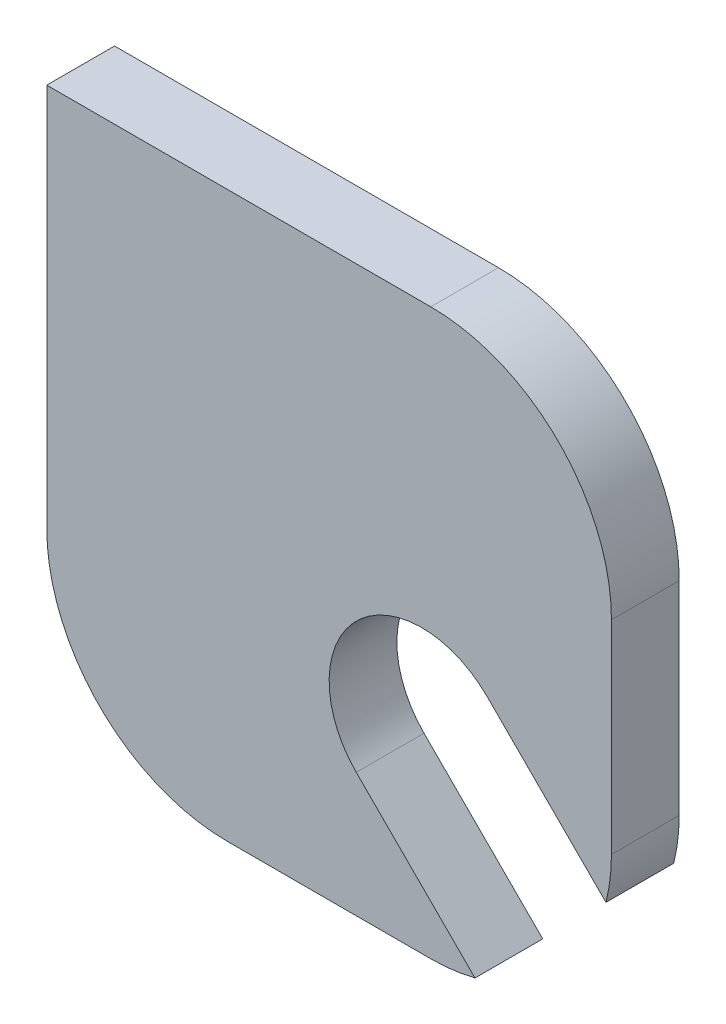
ISO-10303-21;
HEADER;
FILE_DESCRIPTION(('STEP AP214'),'2;1');
FILE_NAME('part.step','',(''),(''),'','','');
FILE_SCHEMA(('AUTOMOTIVE_DESIGN { 1 0 10303 214 1 1 1 1 }'));
ENDSEC;
DATA;
#1=APPLICATION_CONTEXT('core data for automotive mechanical design processes');
#2=APPLICATION_PROTOCOL_DEFINITION('international standard','automotive_design',2000,#1);
#3=PRODUCT_CONTEXT('',#1,'mechanical');
#4=PRODUCT('Part','Part','',(#3));
#5=PRODUCT_RELATED_PRODUCT_CATEGORY('part','',(#4));
#6=PRODUCT_DEFINITION_FORMATION('','',#4);
#7=PRODUCT_DEFINITION_CONTEXT('part definition',#1,'design');
#8=PRODUCT_DEFINITION('design','',#6,#7);
#9=PRODUCT_DEFINITION_SHAPE('','',#8);
#10=(LENGTH_UNIT() NAMED_UNIT(*) SI_UNIT(.MILLI.,.METRE.));
#11=(NAMED_UNIT(*) PLANE_ANGLE_UNIT() SI_UNIT($,.RADIAN.));
#12=(NAMED_UNIT(*) SI_UNIT($,.STERADIAN.) SOLID_ANGLE_UNIT());
#13=UNCERTAINTY_MEASURE_WITH_UNIT(LENGTH_MEASURE(1.E-05),#10,'distance_accuracy_value','');
#14=(GEOMETRIC_REPRESENTATION_CONTEXT(3) GLOBAL_UNCERTAINTY_ASSIGNED_CONTEXT((#13)) GLOBAL_UNIT_ASSIGNED_CONTEXT((#10,
#11,#12)) REPRESENTATION_CONTEXT('',''));
#15=CARTESIAN_POINT('',(0.,0.,0.));
#16=DIRECTION('',(0.,0.,1.));
#17=DIRECTION('',(1.,0.,0.));
#18=AXIS2_PLACEMENT_3D('',#15,#16,#17);
#19=CARTESIAN_POINT('',(4.5,-4.5,3.));
#20=DIRECTION('',(0.,0.,1.));
#21=DIRECTION('',(1.,0.,0.));
#22=AXIS2_PLACEMENT_3D('',#19,#20,#21);
#23=CYLINDRICAL_SURFACE('',#22,8.);
#24=DIRECTION('',(0.,0.,1.));
#25=VECTOR('',#24,1.);
#26=CARTESIAN_POINT('',(6.45833067361547,-12.2566062793452,0.));
#27=LINE('',#26,#25);
#28=CARTESIAN_POINT('',(6.45833067361547,-12.2566062793452,0.));
#29=VERTEX_POINT('',#28);
#30=CARTESIAN_POINT('',(6.45833067361547,-12.2566062793452,3.));
#31=VERTEX_POINT('',#30);
#32=EDGE_CURVE('E212',#29,#31,#27,.T.);
#33=ORIENTED_EDGE('',*,*,#32,.T.);
#34=CARTESIAN_POINT('',(4.5,-4.5,3.));
#35=DIRECTION('',(0.,0.,1.));
#36=DIRECTION('',(1.,0.,0.));
#37=AXIS2_PLACEMENT_3D('',#34,#35,#36);
#38=CIRCLE('',#37,8.);
#39=CARTESIAN_POINT('',(4.5,-12.5,3.));
#40=VERTEX_POINT('',#39);
#41=EDGE_CURVE('E140',#40,#31,#38,.T.);
#42=ORIENTED_EDGE('',*,*,#41,.F.);
#43=DIRECTION('',(0.,0.,1.));
#44=VECTOR('',#43,1.);
#45=CARTESIAN_POINT('',(4.5,-12.5,3.));
#46=LINE('',#45,#44);
#47=CARTESIAN_POINT('',(4.5,-12.5,0.));
#48=VERTEX_POINT('',#47);
#49=EDGE_CURVE('E190',#48,#40,#46,.T.);
#50=ORIENTED_EDGE('',*,*,#49,.F.);
#51=CARTESIAN_POINT('',(4.5,-4.5,0.));
#52=DIRECTION('',(0.,0.,1.));
#53=DIRECTION('',(1.,0.,0.));
#54=AXIS2_PLACEMENT_3D('',#51,#52,#53);
#55=CIRCLE('',#54,8.);
#56=EDGE_CURVE('E138',#29,#48,#55,.F.);
#57=ORIENTED_EDGE('',*,*,#56,.F.);
#58=EDGE_LOOP('',(#33,#42,#50,#57));
#59=FACE_BOUND('',#58,.T.);
#60=ADVANCED_FACE('F35',(#59),#23,.T.);
#61=CARTESIAN_POINT('',(4.5,4.5,3.));
#62=DIRECTION('',(0.,0.,1.));
#63=DIRECTION('',(1.,0.,0.));
#64=AXIS2_PLACEMENT_3D('',#61,#62,#63);
#65=CYLINDRICAL_SURFACE('',#64,8.);
#66=DIRECTION('',(0.,0.,1.));
#67=VECTOR('',#66,1.);
#68=CARTESIAN_POINT('',(12.5,4.5,3.));
#69=LINE('',#68,#67);
#70=CARTESIAN_POINT('',(12.5,4.5,0.));
#71=VERTEX_POINT('',#70);
#72=CARTESIAN_POINT('',(12.5,4.5,3.));
#73=VERTEX_POINT('',#72);
#74=EDGE_CURVE('E147',#71,#73,#69,.T.);
#75=ORIENTED_EDGE('',*,*,#74,.F.);
#76=CARTESIAN_POINT('',(4.5,4.5,0.));
#77=DIRECTION('',(0.,0.,1.));
#78=DIRECTION('',(1.,0.,0.));
#79=AXIS2_PLACEMENT_3D('',#76,#77,#78);
#80=CIRCLE('',#79,8.);
#81=CARTESIAN_POINT('',(4.5,12.5,0.));
#82=VERTEX_POINT('',#81);
#83=EDGE_CURVE('E43',#82,#71,#80,.F.);
#84=ORIENTED_EDGE('',*,*,#83,.F.);
#85=DIRECTION('',(0.,0.,1.));
#86=VECTOR('',#85,1.);
#87=CARTESIAN_POINT('',(4.5,12.5,3.));
#88=LINE('',#87,#86);
#89=CARTESIAN_POINT('',(4.5,12.5,3.));
#90=VERTEX_POINT('',#89);
#91=EDGE_CURVE('E150',#90,#82,#88,.F.);
#92=ORIENTED_EDGE('',*,*,#91,.F.);
#93=CARTESIAN_POINT('',(4.5,4.5,3.));
#94=DIRECTION('',(0.,0.,1.));
#95=DIRECTION('',(1.,0.,0.));
#96=AXIS2_PLACEMENT_3D('',#93,#94,#95);
#97=CIRCLE('',#96,8.);
#98=EDGE_CURVE('E11',#73,#90,#97,.T.);
#99=ORIENTED_EDGE('',*,*,#98,.F.);
#100=EDGE_LOOP('',(#75,#84,#92,#99));
#101=FACE_BOUND('',#100,.T.);
#102=ADVANCED_FACE('F37',(#101),#65,.T.);
#103=DIRECTION('',(0.,0.,1.));
#104=VECTOR('',#103,1.);
#105=CARTESIAN_POINT('',(12.2566062793452,-6.45833067361548,0.));
#106=LINE('',#105,#104);
#107=CARTESIAN_POINT('',(12.2566062793452,-6.45833067361548,0.));
#108=VERTEX_POINT('',#107);
#109=CARTESIAN_POINT('',(12.2566062793452,-6.45833067361548,3.));
#110=VERTEX_POINT('',#109);
#111=EDGE_CURVE('E118',#108,#110,#106,.T.);
#112=ORIENTED_EDGE('',*,*,#111,.F.);
#113=CARTESIAN_POINT('',(12.5,-4.5,0.));
#114=VERTEX_POINT('',#113);
#115=EDGE_CURVE('E130',#114,#108,#55,.F.);
#116=ORIENTED_EDGE('',*,*,#115,.F.);
#117=DIRECTION('',(0.,0.,1.));
#118=VECTOR('',#117,1.);
#119=CARTESIAN_POINT('',(12.5,-4.5,3.));
#120=LINE('',#119,#118);
#121=CARTESIAN_POINT('',(12.5,-4.5,3.));
#122=VERTEX_POINT('',#121);
#123=EDGE_CURVE('E142',#122,#114,#120,.F.);
#124=ORIENTED_EDGE('',*,*,#123,.F.);
#125=EDGE_CURVE('E132',#110,#122,#38,.T.);
#126=ORIENTED_EDGE('',*,*,#125,.F.);
#127=EDGE_LOOP('',(#112,#116,#124,#126));
#128=FACE_BOUND('',#127,.T.);
#129=ADVANCED_FACE('F128',(#128),#23,.T.);
#130=CARTESIAN_POINT('',(-4.5,-4.5,3.));
#131=DIRECTION('',(0.,0.,1.));
#132=DIRECTION('',(1.,0.,0.));
#133=AXIS2_PLACEMENT_3D('',#130,#131,#132);
#134=CYLINDRICAL_SURFACE('',#133,8.);
#135=DIRECTION('',(0.,0.,1.));
#136=VECTOR('',#135,1.);
#137=CARTESIAN_POINT('',(-12.5,-4.5,3.));
#138=LINE('',#137,#136);
#139=CARTESIAN_POINT('',(-12.5,-4.5,0.));
#140=VERTEX_POINT('',#139);
#141=CARTESIAN_POINT('',(-12.5,-4.5,3.));
#142=VERTEX_POINT('',#141);
#143=EDGE_CURVE('E181',#140,#142,#138,.T.);
#144=ORIENTED_EDGE('',*,*,#143,.F.);
#145=CARTESIAN_POINT('',(-4.5,-4.5,0.));
#146=DIRECTION('',(0.,0.,1.));
#147=DIRECTION('',(1.,0.,0.));
#148=AXIS2_PLACEMENT_3D('',#145,#146,#147);
#149=CIRCLE('',#148,8.);
#150=CARTESIAN_POINT('',(-4.5,-12.5,0.));
#151=VERTEX_POINT('',#150);
#152=EDGE_CURVE('E187',#151,#140,#149,.F.);
#153=ORIENTED_EDGE('',*,*,#152,.F.);
#154=DIRECTION('',(0.,0.,1.));
#155=VECTOR('',#154,1.);
#156=CARTESIAN_POINT('',(-4.5,-12.5,3.));
#157=LINE('',#156,#155);
#158=CARTESIAN_POINT('',(-4.5,-12.5,3.));
#159=VERTEX_POINT('',#158);
#160=EDGE_CURVE('E184',#159,#151,#157,.F.);
#161=ORIENTED_EDGE('',*,*,#160,.F.);
#162=CARTESIAN_POINT('',(-4.5,-4.5,3.));
#163=DIRECTION('',(0.,0.,1.));
#164=DIRECTION('',(1.,0.,0.));
#165=AXIS2_PLACEMENT_3D('',#162,#163,#164);
#166=CIRCLE('',#165,8.);
#167=EDGE_CURVE('E189',#142,#159,#166,.T.);
#168=ORIENTED_EDGE('',*,*,#167,.F.);
#169=EDGE_LOOP('',(#144,#153,#161,#168));
#170=FACE_BOUND('',#169,.T.);
#171=ADVANCED_FACE('F240',(#170),#134,.T.);
#172=CARTESIAN_POINT('',(12.5,12.5,3.));
#173=DIRECTION('',(-1.,0.,0.));
#174=DIRECTION('',(0.,-1.,0.));
#175=AXIS2_PLACEMENT_3D('',#172,#173,#174);
#176=PLANE('',#175);
#177=DIRECTION('',(0.,1.,0.));
#178=VECTOR('',#177,1.);
#179=CARTESIAN_POINT('',(12.5,12.5,0.));
#180=LINE('',#179,#178);
#181=EDGE_CURVE('E137',#114,#71,#180,.T.);
#182=ORIENTED_EDGE('',*,*,#181,.T.);
#183=ORIENTED_EDGE('',*,*,#74,.T.);
#184=DIRECTION('',(0.,1.,0.));
#185=VECTOR('',#184,1.);
#186=CARTESIAN_POINT('',(12.5,12.5,3.));
#187=LINE('',#186,#185);
#188=EDGE_CURVE('E177',#122,#73,#187,.T.);
#189=ORIENTED_EDGE('',*,*,#188,.F.);
#190=ORIENTED_EDGE('',*,*,#123,.T.);
#191=EDGE_LOOP('',(#182,#183,#189,#190));
#192=FACE_BOUND('',#191,.T.);
#193=ADVANCED_FACE('F161',(#192),#176,.F.);
#194=CARTESIAN_POINT('',(-12.5,12.5,3.));
#195=DIRECTION('',(0.,-1.,0.));
#196=DIRECTION('',(0.,0.,-1.));
#197=AXIS2_PLACEMENT_3D('',#194,#195,#196);
#198=PLANE('',#197);
#199=DIRECTION('',(-1.,0.,0.));
#200=VECTOR('',#199,1.);
#201=CARTESIAN_POINT('',(-12.5,12.5,3.));
#202=LINE('',#201,#200);
#203=CARTESIAN_POINT('',(-12.5,12.5,3.));
#204=VERTEX_POINT('',#203);
#205=EDGE_CURVE('E206',#90,#204,#202,.T.);
#206=ORIENTED_EDGE('',*,*,#205,.F.);
#207=ORIENTED_EDGE('',*,*,#91,.T.);
#208=DIRECTION('',(-1.,0.,0.));
#209=VECTOR('',#208,1.);
#210=CARTESIAN_POINT('',(-12.5,12.5,0.));
#211=LINE('',#210,#209);
#212=CARTESIAN_POINT('',(-12.5,12.5,0.));
#213=VERTEX_POINT('',#212);
#214=EDGE_CURVE('E155',#82,#213,#211,.T.);
#215=ORIENTED_EDGE('',*,*,#214,.T.);
#216=DIRECTION('',(0.,0.,-1.));
#217=VECTOR('',#216,1.);
#218=CARTESIAN_POINT('',(-12.5,12.5,3.));
#219=LINE('',#218,#217);
#220=EDGE_CURVE('E178',#204,#213,#219,.T.);
#221=ORIENTED_EDGE('',*,*,#220,.F.);
#222=EDGE_LOOP('',(#206,#207,#215,#221));
#223=FACE_BOUND('',#222,.T.);
#224=ADVANCED_FACE('F248',(#223),#198,.F.);
#225=CARTESIAN_POINT('',(-12.5,12.5,3.));
#226=DIRECTION('',(1.,0.,0.));
#227=DIRECTION('',(0.,1.,0.));
#228=AXIS2_PLACEMENT_3D('',#225,#226,#227);
#229=PLANE('',#228);
#230=DIRECTION('',(0.,-1.,0.));
#231=VECTOR('',#230,1.);
#232=CARTESIAN_POINT('',(-12.5,12.5,0.));
#233=LINE('',#232,#231);
#234=EDGE_CURVE('E164',#213,#140,#233,.T.);
#235=ORIENTED_EDGE('',*,*,#234,.T.);
#236=ORIENTED_EDGE('',*,*,#143,.T.);
#237=DIRECTION('',(0.,-1.,0.));
#238=VECTOR('',#237,1.);
#239=CARTESIAN_POINT('',(-12.5,12.5,3.));
#240=LINE('',#239,#238);
#241=EDGE_CURVE('E205',#204,#142,#240,.T.);
#242=ORIENTED_EDGE('',*,*,#241,.F.);
#243=ORIENTED_EDGE('',*,*,#220,.T.);
#244=EDGE_LOOP('',(#235,#236,#242,#243));
#245=FACE_BOUND('',#244,.T.);
#246=ADVANCED_FACE('F254',(#245),#229,.F.);
#247=CARTESIAN_POINT('',(-12.5,-12.5,3.));
#248=DIRECTION('',(0.,1.,0.));
#249=DIRECTION('',(0.,0.,1.));
#250=AXIS2_PLACEMENT_3D('',#247,#248,#249);
#251=PLANE('',#250);
#252=DIRECTION('',(1.,0.,0.));
#253=VECTOR('',#252,1.);
#254=CARTESIAN_POINT('',(-12.5,-12.5,0.));
#255=LINE('',#254,#253);
#256=EDGE_CURVE('E174',#151,#48,#255,.T.);
#257=ORIENTED_EDGE('',*,*,#256,.T.);
#258=ORIENTED_EDGE('',*,*,#49,.T.);
#259=DIRECTION('',(1.,0.,0.));
#260=VECTOR('',#259,1.);
#261=CARTESIAN_POINT('',(-12.5,-12.5,3.));
#262=LINE('',#261,#260);
#263=EDGE_CURVE('E169',#159,#40,#262,.T.);
#264=ORIENTED_EDGE('',*,*,#263,.F.);
#265=ORIENTED_EDGE('',*,*,#160,.T.);
#266=EDGE_LOOP('',(#257,#258,#264,#265));
#267=FACE_BOUND('',#266,.T.);
#268=ADVANCED_FACE('F196',(#267),#251,.F.);
#269=CARTESIAN_POINT('',(0.,0.,3.));
#270=DIRECTION('',(0.,0.,1.));
#271=DIRECTION('',(1.,0.,0.));
#272=AXIS2_PLACEMENT_3D('',#269,#270,#271);
#273=PLANE('',#272);
#274=DIRECTION('',(0.707106781186547,-0.707106781186548,0.));
#275=VECTOR('',#274,1.);
#276=CARTESIAN_POINT('',(1.20086219713516,-6.99913780286484,3.));
#277=LINE('',#276,#275);
#278=CARTESIAN_POINT('',(1.20086219713516,-6.99913780286484,3.));
#279=VERTEX_POINT('',#278);
#280=EDGE_CURVE('E124',#279,#31,#277,.T.);
#281=ORIENTED_EDGE('',*,*,#280,.F.);
#282=CARTESIAN_POINT('',(4.1,-4.1,3.));
#283=DIRECTION('',(0.,0.,1.));
#284=DIRECTION('',(1.,0.,0.));
#285=AXIS2_PLACEMENT_3D('',#282,#283,#284);
#286=CIRCLE('',#285,4.1);
#287=CARTESIAN_POINT('',(6.99913780286484,-1.20086219713516,3.));
#288=VERTEX_POINT('',#287);
#289=EDGE_CURVE('E166',#288,#279,#286,.T.);
#290=ORIENTED_EDGE('',*,*,#289,.F.);
#291=DIRECTION('',(-0.707106781186547,0.707106781186548,0.));
#292=VECTOR('',#291,1.);
#293=CARTESIAN_POINT('',(12.2566062793452,-6.45833067361548,3.));
#294=LINE('',#293,#292);
#295=EDGE_CURVE('E50',#110,#288,#294,.T.);
#296=ORIENTED_EDGE('',*,*,#295,.F.);
#297=ORIENTED_EDGE('',*,*,#125,.T.);
#298=ORIENTED_EDGE('',*,*,#188,.T.);
#299=ORIENTED_EDGE('',*,*,#98,.T.);
#300=ORIENTED_EDGE('',*,*,#205,.T.);
#301=ORIENTED_EDGE('',*,*,#241,.T.);
#302=ORIENTED_EDGE('',*,*,#167,.T.);
#303=ORIENTED_EDGE('',*,*,#263,.T.);
#304=ORIENTED_EDGE('',*,*,#41,.T.);
#305=EDGE_LOOP('',(#281,#290,#296,#297,#298,#299,#300,#301,#302,#303,#304));
#306=FACE_BOUND('',#305,.T.);
#307=ADVANCED_FACE('F202',(#306),#273,.T.);
#308=CARTESIAN_POINT('',(0.,0.,0.));
#309=DIRECTION('',(0.,0.,1.));
#310=DIRECTION('',(1.,0.,0.));
#311=AXIS2_PLACEMENT_3D('',#308,#309,#310);
#312=PLANE('',#311);
#313=CARTESIAN_POINT('',(4.1,-4.1,0.));
#314=DIRECTION('',(0.,0.,1.));
#315=DIRECTION('',(1.,0.,0.));
#316=AXIS2_PLACEMENT_3D('',#313,#314,#315);
#317=CIRCLE('',#316,4.1);
#318=CARTESIAN_POINT('',(6.99913780286485,-1.20086219713516,0.));
#319=VERTEX_POINT('',#318);
#320=CARTESIAN_POINT('',(1.20086219713516,-6.99913780286484,0.));
#321=VERTEX_POINT('',#320);
#322=EDGE_CURVE('E162',#319,#321,#317,.T.);
#323=ORIENTED_EDGE('',*,*,#322,.T.);
#324=DIRECTION('',(0.707106781186547,-0.707106781186548,0.));
#325=VECTOR('',#324,1.);
#326=CARTESIAN_POINT('',(1.20086219713516,-6.99913780286484,0.));
#327=LINE('',#326,#325);
#328=EDGE_CURVE('E58',#321,#29,#327,.T.);
#329=ORIENTED_EDGE('',*,*,#328,.T.);
#330=ORIENTED_EDGE('',*,*,#56,.T.);
#331=ORIENTED_EDGE('',*,*,#256,.F.);
#332=ORIENTED_EDGE('',*,*,#152,.T.);
#333=ORIENTED_EDGE('',*,*,#234,.F.);
#334=ORIENTED_EDGE('',*,*,#214,.F.);
#335=ORIENTED_EDGE('',*,*,#83,.T.);
#336=ORIENTED_EDGE('',*,*,#181,.F.);
#337=ORIENTED_EDGE('',*,*,#115,.T.);
#338=DIRECTION('',(-0.707106781186547,0.707106781186548,0.));
#339=VECTOR('',#338,1.);
#340=CARTESIAN_POINT('',(12.2566062793452,-6.45833067361548,0.));
#341=LINE('',#340,#339);
#342=EDGE_CURVE('E115',#108,#319,#341,.T.);
#343=ORIENTED_EDGE('',*,*,#342,.T.);
#344=EDGE_LOOP('',(#323,#329,#330,#331,#332,#333,#334,#335,#336,#337,#343));
#345=FACE_BOUND('',#344,.T.);
#346=ADVANCED_FACE('F135',(#345),#312,.F.);
#347=CARTESIAN_POINT('',(4.1,-4.1,0.));
#348=DIRECTION('',(0.,0.,1.));
#349=DIRECTION('',(1.,0.,0.));
#350=AXIS2_PLACEMENT_3D('',#347,#348,#349);
#351=CYLINDRICAL_SURFACE('',#350,4.1);
#352=ORIENTED_EDGE('',*,*,#289,.T.);
#353=DIRECTION('',(0.,0.,1.));
#354=VECTOR('',#353,1.);
#355=CARTESIAN_POINT('',(1.20086219713516,-6.99913780286484,0.));
#356=LINE('',#355,#354);
#357=EDGE_CURVE('E215',#321,#279,#356,.T.);
#358=ORIENTED_EDGE('',*,*,#357,.F.);
#359=ORIENTED_EDGE('',*,*,#322,.F.);
#360=DIRECTION('',(0.,0.,1.));
#361=VECTOR('',#360,1.);
#362=CARTESIAN_POINT('',(6.99913780286485,-1.20086219713516,0.));
#363=LINE('',#362,#361);
#364=EDGE_CURVE('E119',#319,#288,#363,.T.);
#365=ORIENTED_EDGE('',*,*,#364,.T.);
#366=EDGE_LOOP('',(#352,#358,#359,#365));
#367=FACE_BOUND('',#366,.T.);
#368=ADVANCED_FACE('F224',(#367),#351,.F.);
#369=CARTESIAN_POINT('',(12.2566062793452,-6.45833067361548,0.));
#370=DIRECTION('',(0.707106781186548,0.707106781186547,0.));
#371=DIRECTION('',(-0.707106781186547,0.707106781186548,0.));
#372=AXIS2_PLACEMENT_3D('',#369,#370,#371);
#373=PLANE('',#372);
#374=ORIENTED_EDGE('',*,*,#295,.T.);
#375=ORIENTED_EDGE('',*,*,#364,.F.);
#376=ORIENTED_EDGE('',*,*,#342,.F.);
#377=ORIENTED_EDGE('',*,*,#111,.T.);
#378=EDGE_LOOP('',(#374,#375,#376,#377));
#379=FACE_BOUND('',#378,.T.);
#380=ADVANCED_FACE('F117',(#379),#373,.F.);
#381=CARTESIAN_POINT('',(1.20086219713516,-6.99913780286484,0.));
#382=DIRECTION('',(-0.707106781186548,-0.707106781186547,0.));
#383=DIRECTION('',(0.707106781186547,-0.707106781186548,0.));
#384=AXIS2_PLACEMENT_3D('',#381,#382,#383);
#385=PLANE('',#384);
#386=ORIENTED_EDGE('',*,*,#280,.T.);
#387=ORIENTED_EDGE('',*,*,#32,.F.);
#388=ORIENTED_EDGE('',*,*,#328,.F.);
#389=ORIENTED_EDGE('',*,*,#357,.T.);
#390=EDGE_LOOP('',(#386,#387,#388,#389));
#391=FACE_BOUND('',#390,.T.);
#392=ADVANCED_FACE('F221',(#391),#385,.F.);
#393=CLOSED_SHELL('',(#60,#102,#129,#171,#193,#224,#246,#268,#307,#346,#368,#380,#392));
#394=MANIFOLD_SOLID_BREP('B2',#393);
#395=ADVANCED_BREP_SHAPE_REPRESENTATION('',(#18,#394),#14);
#396=SHAPE_DEFINITION_REPRESENTATION(#9,#395);
ENDSEC;
END-ISO-10303-21;
